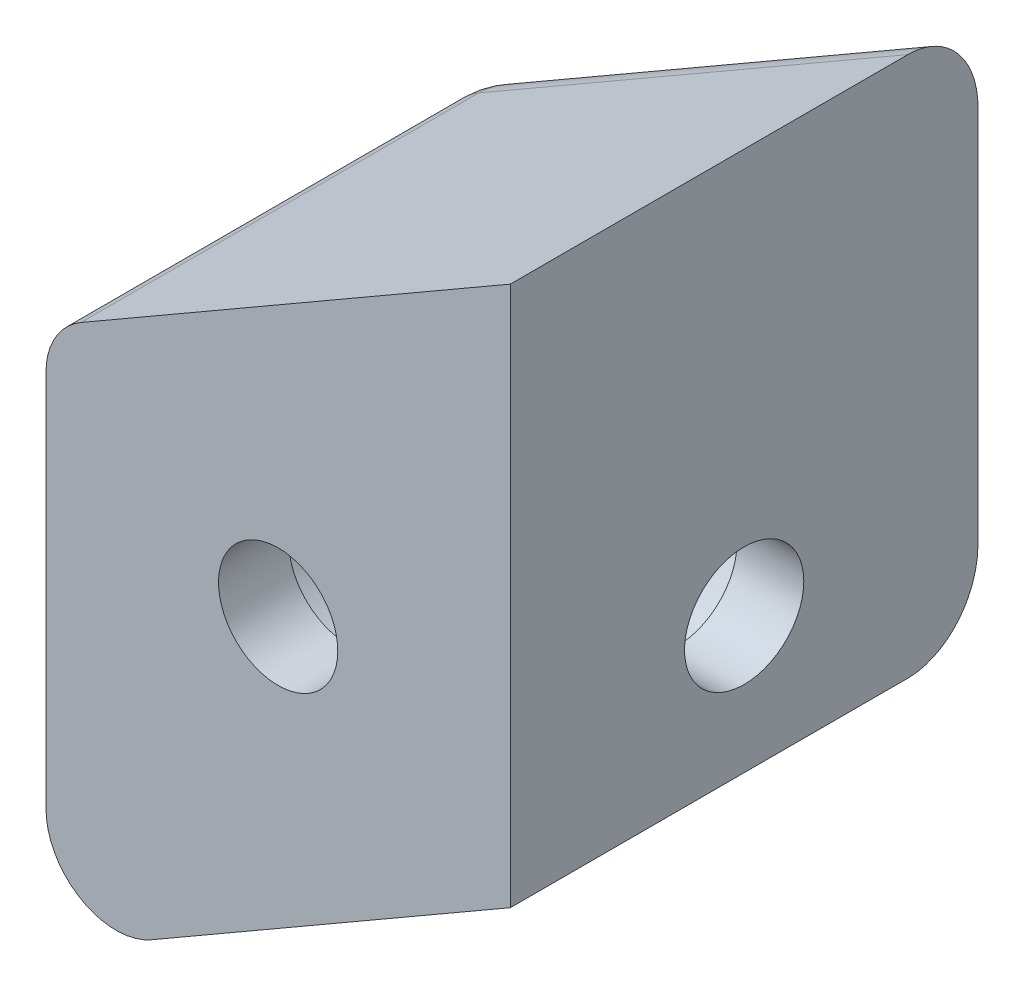
ISO-10303-21;
HEADER;
FILE_DESCRIPTION(('STEP AP214'),'2;1');
FILE_NAME('part.step','',(''),(''),'','','');
FILE_SCHEMA(('AUTOMOTIVE_DESIGN { 1 0 10303 214 1 1 1 1 }'));
ENDSEC;
DATA;
#1=APPLICATION_CONTEXT('core data for automotive mechanical design processes');
#2=APPLICATION_PROTOCOL_DEFINITION('international standard','automotive_design',2000,#1);
#3=PRODUCT_CONTEXT('',#1,'mechanical');
#4=PRODUCT('Part','Part','',(#3));
#5=PRODUCT_RELATED_PRODUCT_CATEGORY('part','',(#4));
#6=PRODUCT_DEFINITION_FORMATION('','',#4);
#7=PRODUCT_DEFINITION_CONTEXT('part definition',#1,'design');
#8=PRODUCT_DEFINITION('design','',#6,#7);
#9=PRODUCT_DEFINITION_SHAPE('','',#8);
#10=(LENGTH_UNIT() NAMED_UNIT(*) SI_UNIT(.MILLI.,.METRE.));
#11=(NAMED_UNIT(*) PLANE_ANGLE_UNIT() SI_UNIT($,.RADIAN.));
#12=(NAMED_UNIT(*) SI_UNIT($,.STERADIAN.) SOLID_ANGLE_UNIT());
#13=UNCERTAINTY_MEASURE_WITH_UNIT(LENGTH_MEASURE(1.E-05),#10,'distance_accuracy_value','');
#14=(GEOMETRIC_REPRESENTATION_CONTEXT(3) GLOBAL_UNCERTAINTY_ASSIGNED_CONTEXT((#13)) GLOBAL_UNIT_ASSIGNED_CONTEXT((#10,
#11,#12)) REPRESENTATION_CONTEXT('',''));
#15=CARTESIAN_POINT('',(0.,0.,0.));
#16=DIRECTION('',(0.,0.,1.));
#17=DIRECTION('',(1.,0.,0.));
#18=AXIS2_PLACEMENT_3D('',#15,#16,#17);
#19=CARTESIAN_POINT('',(-0.0727880054088277,7.27847851737973,17.));
#20=DIRECTION('',(0.,0.,-1.));
#21=DIRECTION('',(-1.,0.,0.));
#22=AXIS2_PLACEMENT_3D('',#19,#20,#21);
#23=CYLINDRICAL_SURFACE('',#22,5.3);
#24=CARTESIAN_POINT('',(-0.0727880054088277,7.27847851737973,0.));
#25=DIRECTION('',(0.,0.,1.));
#26=DIRECTION('',(1.,0.,0.));
#27=AXIS2_PLACEMENT_3D('',#24,#25,#26);
#28=CIRCLE('',#27,5.3);
#29=CARTESIAN_POINT('',(5.22721199459117,7.27847851737973,0.));
#30=VERTEX_POINT('',#29);
#31=EDGE_CURVE('E132',#30,#30,#28,.T.);
#32=ORIENTED_EDGE('',*,*,#31,.F.);
#33=EDGE_LOOP('',(#32));
#34=FACE_BOUND('',#33,.T.);
#35=CARTESIAN_POINT('',(-0.0727880054088277,7.27847851737973,10.));
#36=DIRECTION('',(0.707106781186547,0.,-0.707106781186547));
#37=DIRECTION('',(-0.707106781186547,0.,-0.707106781186547));
#38=AXIS2_PLACEMENT_3D('',#35,#36,#37);
#39=ELLIPSE('',#38,7.4953318805774,5.3);
#40=CARTESIAN_POINT('',(-0.0727880054088277,12.5784785173797,10.));
#41=VERTEX_POINT('',#40);
#42=CARTESIAN_POINT('',(-0.0727880054088277,1.97847851737973,10.));
#43=VERTEX_POINT('',#42);
#44=EDGE_CURVE('E116',#41,#43,#39,.F.);
#45=ORIENTED_EDGE('',*,*,#44,.T.);
#46=CARTESIAN_POINT('',(-0.0727880054088277,7.27847851737973,10.));
#47=DIRECTION('',(-0.707106781186547,0.,-0.707106781186547));
#48=DIRECTION('',(0.707106781186547,0.,-0.707106781186547));
#49=AXIS2_PLACEMENT_3D('',#46,#47,#48);
#50=ELLIPSE('',#49,7.4953318805774,5.3);
#51=EDGE_CURVE('E112',#43,#41,#50,.F.);
#52=ORIENTED_EDGE('',*,*,#51,.T.);
#53=EDGE_LOOP('',(#45,#52));
#54=FACE_BOUND('',#53,.T.);
#55=ADVANCED_FACE('F32',(#34,#54),#23,.F.);
#56=CARTESIAN_POINT('',(-0.0727880054088277,7.27847851737973,16.3));
#57=DIRECTION('',(0.,0.,1.));
#58=DIRECTION('',(1.,0.,0.));
#59=AXIS2_PLACEMENT_3D('',#56,#57,#58);
#60=CIRCLE('',#59,5.3);
#61=CARTESIAN_POINT('',(5.22721199459117,7.27847851737973,16.3));
#62=VERTEX_POINT('',#61);
#63=EDGE_CURVE('E139',#62,#62,#60,.T.);
#64=ORIENTED_EDGE('',*,*,#63,.T.);
#65=EDGE_LOOP('',(#64));
#66=FACE_BOUND('',#65,.T.);
#67=CARTESIAN_POINT('',(-0.0727880054088277,7.27847851737973,10.));
#68=DIRECTION('',(0.707106781186547,0.,-0.707106781186547));
#69=DIRECTION('',(-0.707106781186547,0.,-0.707106781186547));
#70=AXIS2_PLACEMENT_3D('',#67,#68,#69);
#71=ELLIPSE('',#70,7.4953318805774,5.3);
#72=EDGE_CURVE('E108',#41,#43,#71,.T.);
#73=ORIENTED_EDGE('',*,*,#72,.T.);
#74=CARTESIAN_POINT('',(-0.0727880054088277,7.27847851737973,10.));
#75=DIRECTION('',(-0.707106781186547,0.,-0.707106781186547));
#76=DIRECTION('',(0.707106781186547,0.,-0.707106781186547));
#77=AXIS2_PLACEMENT_3D('',#74,#75,#76);
#78=ELLIPSE('',#77,7.4953318805774,5.3);
#79=EDGE_CURVE('E115',#43,#41,#78,.T.);
#80=ORIENTED_EDGE('',*,*,#79,.T.);
#81=EDGE_LOOP('',(#73,#80));
#82=FACE_BOUND('',#81,.T.);
#83=ADVANCED_FACE('F126',(#66,#82),#23,.F.);
#84=CARTESIAN_POINT('',(-10.,7.27847851737973,10.));
#85=DIRECTION('',(1.,0.,0.));
#86=DIRECTION('',(0.,0.,-1.));
#87=AXIS2_PLACEMENT_3D('',#84,#85,#86);
#88=CYLINDRICAL_SURFACE('',#87,2.55);
#89=CARTESIAN_POINT('',(7.,7.27847851737973,10.));
#90=DIRECTION('',(1.,0.,0.));
#91=DIRECTION('',(0.,0.,-1.));
#92=AXIS2_PLACEMENT_3D('',#89,#90,#91);
#93=CIRCLE('',#92,2.55);
#94=CARTESIAN_POINT('',(7.,7.27847851737973,7.45));
#95=VERTEX_POINT('',#94);
#96=EDGE_CURVE('E129',#95,#95,#93,.F.);
#97=ORIENTED_EDGE('',*,*,#96,.T.);
#98=EDGE_LOOP('',(#97));
#99=FACE_BOUND('',#98,.T.);
#100=CARTESIAN_POINT('',(9.8544239891824,7.27847851737973,10.));
#101=DIRECTION('',(1.,0.,0.));
#102=DIRECTION('',(0.,0.,-1.));
#103=AXIS2_PLACEMENT_3D('',#100,#101,#102);
#104=CIRCLE('',#103,2.55);
#105=CARTESIAN_POINT('',(9.8544239891824,7.27847851737973,7.45));
#106=VERTEX_POINT('',#105);
#107=EDGE_CURVE('E261',#106,#106,#104,.T.);
#108=ORIENTED_EDGE('',*,*,#107,.T.);
#109=EDGE_LOOP('',(#108));
#110=FACE_BOUND('',#109,.T.);
#111=ADVANCED_FACE('F242',(#99,#110),#88,.F.);
#112=CARTESIAN_POINT('',(-0.0727880054088277,7.27847851737973,20.));
#113=DIRECTION('',(0.,0.,-1.));
#114=DIRECTION('',(-1.,0.,0.));
#115=AXIS2_PLACEMENT_3D('',#112,#113,#114);
#116=CYLINDRICAL_SURFACE('',#115,2.55);
#117=CARTESIAN_POINT('',(-0.0727880054088277,7.27847851737973,17.));
#118=DIRECTION('',(0.,0.,1.));
#119=DIRECTION('',(1.,0.,0.));
#120=AXIS2_PLACEMENT_3D('',#117,#118,#119);
#121=CIRCLE('',#120,2.55);
#122=CARTESIAN_POINT('',(2.47721199459117,7.27847851737973,17.));
#123=VERTEX_POINT('',#122);
#124=EDGE_CURVE('E260',#123,#123,#121,.T.);
#125=ORIENTED_EDGE('',*,*,#124,.F.);
#126=EDGE_LOOP('',(#125));
#127=FACE_BOUND('',#126,.T.);
#128=CARTESIAN_POINT('',(-0.0727880054088277,7.27847851737973,20.));
#129=DIRECTION('',(0.,0.,1.));
#130=DIRECTION('',(1.,0.,0.));
#131=AXIS2_PLACEMENT_3D('',#128,#129,#130);
#132=CIRCLE('',#131,2.55);
#133=CARTESIAN_POINT('',(2.47721199459117,7.27847851737973,20.));
#134=VERTEX_POINT('',#133);
#135=EDGE_CURVE('E264',#134,#134,#132,.T.);
#136=ORIENTED_EDGE('',*,*,#135,.T.);
#137=EDGE_LOOP('',(#136));
#138=FACE_BOUND('',#137,.T.);
#139=ADVANCED_FACE('F219',(#127,#138),#116,.F.);
#140=CARTESIAN_POINT('',(-10.,-10.,20.));
#141=DIRECTION('',(-0.500000000000001,0.866025403784438,0.));
#142=DIRECTION('',(-0.866025403784438,-0.500000000000001,0.));
#143=AXIS2_PLACEMENT_3D('',#140,#141,#142);
#144=PLANE('',#143);
#145=DIRECTION('',(0.,0.,-1.));
#146=VECTOR('',#145,1.);
#147=CARTESIAN_POINT('',(-5.5,-7.40192378864668,20.));
#148=LINE('',#147,#146);
#149=CARTESIAN_POINT('',(-5.5,-7.40192378864668,20.));
#150=VERTEX_POINT('',#149);
#151=CARTESIAN_POINT('',(-5.5,-7.40192378864668,3.));
#152=VERTEX_POINT('',#151);
#153=EDGE_CURVE('E145',#150,#152,#148,.T.);
#154=ORIENTED_EDGE('',*,*,#153,.T.);
#155=DIRECTION('',(0.866025403784438,0.500000000000001,0.));
#156=VECTOR('',#155,1.);
#157=CARTESIAN_POINT('',(-10.,-10.,3.));
#158=LINE('',#157,#156);
#159=CARTESIAN_POINT('',(9.8544239891824,1.46295703475946,3.));
#160=VERTEX_POINT('',#159);
#161=EDGE_CURVE('E147',#152,#160,#158,.T.);
#162=ORIENTED_EDGE('',*,*,#161,.T.);
#163=DIRECTION('',(0.,0.,-1.));
#164=VECTOR('',#163,1.);
#165=CARTESIAN_POINT('',(9.8544239891824,1.46295703475946,20.));
#166=LINE('',#165,#164);
#167=CARTESIAN_POINT('',(9.8544239891824,1.46295703475946,20.));
#168=VERTEX_POINT('',#167);
#169=EDGE_CURVE('E122',#168,#160,#166,.T.);
#170=ORIENTED_EDGE('',*,*,#169,.F.);
#171=DIRECTION('',(0.866025403784438,0.500000000000001,0.));
#172=VECTOR('',#171,1.);
#173=CARTESIAN_POINT('',(-10.,-10.,20.));
#174=LINE('',#173,#172);
#175=EDGE_CURVE('E277',#150,#168,#174,.T.);
#176=ORIENTED_EDGE('',*,*,#175,.F.);
#177=EDGE_LOOP('',(#154,#162,#170,#176));
#178=FACE_BOUND('',#177,.T.);
#179=ADVANCED_FACE('F215',(#178),#144,.F.);
#180=CARTESIAN_POINT('',(9.8544239891824,1.46295703475946,20.));
#181=DIRECTION('',(-1.,0.,0.));
#182=DIRECTION('',(0.,-1.,0.));
#183=AXIS2_PLACEMENT_3D('',#180,#181,#182);
#184=PLANE('',#183);
#185=ORIENTED_EDGE('',*,*,#107,.F.);
#186=EDGE_LOOP('',(#185));
#187=FACE_BOUND('',#186,.T.);
#188=ORIENTED_EDGE('',*,*,#169,.T.);
#189=CARTESIAN_POINT('',(9.85442398918238,4.9270586498972,3.));
#190=DIRECTION('',(-1.,0.,0.));
#191=DIRECTION('',(0.,1.,0.));
#192=AXIS2_PLACEMENT_3D('',#189,#190,#191);
#193=ELLIPSE('',#192,3.46410161513775,3.);
#194=CARTESIAN_POINT('',(9.85442398918238,4.92705864989721,0.));
#195=VERTEX_POINT('',#194);
#196=EDGE_CURVE('E152',#160,#195,#193,.F.);
#197=ORIENTED_EDGE('',*,*,#196,.T.);
#198=DIRECTION('',(0.,1.,0.));
#199=VECTOR('',#198,1.);
#200=CARTESIAN_POINT('',(9.8544239891824,1.46295703475946,0.));
#201=LINE('',#200,#199);
#202=CARTESIAN_POINT('',(9.85442398918232,21.0928554196217,0.));
#203=VERTEX_POINT('',#202);
#204=EDGE_CURVE('E274',#195,#203,#201,.T.);
#205=ORIENTED_EDGE('',*,*,#204,.T.);
#206=CARTESIAN_POINT('',(9.85442398918232,21.0928554196217,3.));
#207=DIRECTION('',(-1.,0.,0.));
#208=DIRECTION('',(0.,-1.,0.));
#209=AXIS2_PLACEMENT_3D('',#206,#207,#208);
#210=ELLIPSE('',#209,3.46410161513775,3.);
#211=CARTESIAN_POINT('',(9.85442398918231,24.5569570347595,3.));
#212=VERTEX_POINT('',#211);
#213=EDGE_CURVE('E150',#203,#212,#210,.F.);
#214=ORIENTED_EDGE('',*,*,#213,.T.);
#215=DIRECTION('',(0.,0.,-1.));
#216=VECTOR('',#215,1.);
#217=CARTESIAN_POINT('',(9.85442398918231,24.5569570347595,20.));
#218=LINE('',#217,#216);
#219=CARTESIAN_POINT('',(9.85442398918231,24.5569570347595,20.));
#220=VERTEX_POINT('',#219);
#221=EDGE_CURVE('E271',#220,#212,#218,.T.);
#222=ORIENTED_EDGE('',*,*,#221,.F.);
#223=DIRECTION('',(0.,1.,0.));
#224=VECTOR('',#223,1.);
#225=CARTESIAN_POINT('',(9.8544239891824,1.46295703475946,20.));
#226=LINE('',#225,#224);
#227=EDGE_CURVE('E282',#168,#220,#226,.T.);
#228=ORIENTED_EDGE('',*,*,#227,.F.);
#229=EDGE_LOOP('',(#188,#197,#205,#214,#222,#228));
#230=FACE_BOUND('',#229,.T.);
#231=ADVANCED_FACE('F218',(#187,#230),#184,.F.);
#232=CARTESIAN_POINT('',(-10.,13.094,20.));
#233=DIRECTION('',(0.500000000000002,-0.866025403784438,0.));
#234=DIRECTION('',(0.866025403784438,0.500000000000002,0.));
#235=AXIS2_PLACEMENT_3D('',#232,#233,#234);
#236=PLANE('',#235);
#237=DIRECTION('',(-0.866025403784438,-0.500000000000002,0.));
#238=VECTOR('',#237,1.);
#239=CARTESIAN_POINT('',(-10.,13.094,3.));
#240=LINE('',#239,#238);
#241=CARTESIAN_POINT('',(-8.50000000000002,13.9600254037845,3.));
#242=VERTEX_POINT('',#241);
#243=EDGE_CURVE('E41',#212,#242,#240,.T.);
#244=ORIENTED_EDGE('',*,*,#243,.T.);
#245=DIRECTION('',(0.,0.,-1.));
#246=VECTOR('',#245,1.);
#247=CARTESIAN_POINT('',(-8.50000000000002,13.9600254037845,20.));
#248=LINE('',#247,#246);
#249=CARTESIAN_POINT('',(-8.50000000000002,13.9600254037845,20.));
#250=VERTEX_POINT('',#249);
#251=EDGE_CURVE('E11',#242,#250,#248,.F.);
#252=ORIENTED_EDGE('',*,*,#251,.T.);
#253=DIRECTION('',(-0.866025403784438,-0.500000000000002,0.));
#254=VECTOR('',#253,1.);
#255=CARTESIAN_POINT('',(-10.,13.094,20.));
#256=LINE('',#255,#254);
#257=EDGE_CURVE('E280',#220,#250,#256,.T.);
#258=ORIENTED_EDGE('',*,*,#257,.F.);
#259=ORIENTED_EDGE('',*,*,#221,.T.);
#260=EDGE_LOOP('',(#244,#252,#258,#259));
#261=FACE_BOUND('',#260,.T.);
#262=ADVANCED_FACE('F223',(#261),#236,.F.);
#263=CARTESIAN_POINT('',(-10.,-10.,20.));
#264=DIRECTION('',(1.,0.,0.));
#265=DIRECTION('',(0.,1.,0.));
#266=AXIS2_PLACEMENT_3D('',#263,#264,#265);
#267=PLANE('',#266);
#268=DIRECTION('',(0.,-1.,0.));
#269=VECTOR('',#268,1.);
#270=CARTESIAN_POINT('',(-10.,-10.,20.));
#271=LINE('',#270,#269);
#272=CARTESIAN_POINT('',(-10.,11.3619491924312,20.));
#273=VERTEX_POINT('',#272);
#274=CARTESIAN_POINT('',(-10.,-4.80384757729337,20.));
#275=VERTEX_POINT('',#274);
#276=EDGE_CURVE('E273',#273,#275,#271,.T.);
#277=ORIENTED_EDGE('',*,*,#276,.F.);
#278=DIRECTION('',(0.,0.,-1.));
#279=VECTOR('',#278,1.);
#280=CARTESIAN_POINT('',(-10.,11.3619491924312,20.));
#281=LINE('',#280,#279);
#282=CARTESIAN_POINT('',(-10.,11.3619491924312,13.3786487307791));
#283=VERTEX_POINT('',#282);
#284=EDGE_CURVE('E166',#273,#283,#281,.T.);
#285=ORIENTED_EDGE('',*,*,#284,.T.);
#286=CARTESIAN_POINT('',(-10.,7.27847851737973,10.));
#287=DIRECTION('',(1.,0.,0.));
#288=DIRECTION('',(0.,0.,-1.));
#289=AXIS2_PLACEMENT_3D('',#286,#287,#288);
#290=CIRCLE('',#289,5.3);
#291=CARTESIAN_POINT('',(-10.,11.3619491924312,6.62135126922092));
#292=VERTEX_POINT('',#291);
#293=EDGE_CURVE('E133',#283,#292,#290,.T.);
#294=ORIENTED_EDGE('',*,*,#293,.T.);
#295=DIRECTION('',(0.,0.,-1.));
#296=VECTOR('',#295,1.);
#297=CARTESIAN_POINT('',(-10.,11.3619491924312,20.));
#298=LINE('',#297,#296);
#299=CARTESIAN_POINT('',(-10.,11.3619491924312,3.));
#300=VERTEX_POINT('',#299);
#301=EDGE_CURVE('E162',#292,#300,#298,.T.);
#302=ORIENTED_EDGE('',*,*,#301,.T.);
#303=DIRECTION('',(0.,-1.,0.));
#304=VECTOR('',#303,1.);
#305=CARTESIAN_POINT('',(-10.,-10.,3.));
#306=LINE('',#305,#304);
#307=CARTESIAN_POINT('',(-10.,-4.80384757729337,3.));
#308=VERTEX_POINT('',#307);
#309=EDGE_CURVE('E160',#300,#308,#306,.T.);
#310=ORIENTED_EDGE('',*,*,#309,.T.);
#311=DIRECTION('',(0.,0.,-1.));
#312=VECTOR('',#311,1.);
#313=CARTESIAN_POINT('',(-10.,-4.80384757729337,20.));
#314=LINE('',#313,#312);
#315=EDGE_CURVE('E164',#308,#275,#314,.F.);
#316=ORIENTED_EDGE('',*,*,#315,.T.);
#317=EDGE_LOOP('',(#277,#285,#294,#302,#310,#316));
#318=FACE_BOUND('',#317,.T.);
#319=ADVANCED_FACE('F227',(#318),#267,.F.);
#320=CARTESIAN_POINT('',(0.,0.,20.));
#321=DIRECTION('',(0.,0.,1.));
#322=DIRECTION('',(1.,0.,0.));
#323=AXIS2_PLACEMENT_3D('',#320,#321,#322);
#324=PLANE('',#323);
#325=ORIENTED_EDGE('',*,*,#135,.F.);
#326=EDGE_LOOP('',(#325));
#327=FACE_BOUND('',#326,.T.);
#328=ORIENTED_EDGE('',*,*,#276,.T.);
#329=CARTESIAN_POINT('',(-7.00000000000001,-4.80384757729336,20.));
#330=DIRECTION('',(0.,0.,1.));
#331=DIRECTION('',(1.,0.,0.));
#332=AXIS2_PLACEMENT_3D('',#329,#330,#331);
#333=CIRCLE('',#332,3.);
#334=EDGE_CURVE('E170',#275,#150,#333,.T.);
#335=ORIENTED_EDGE('',*,*,#334,.T.);
#336=ORIENTED_EDGE('',*,*,#175,.T.);
#337=ORIENTED_EDGE('',*,*,#227,.T.);
#338=ORIENTED_EDGE('',*,*,#257,.T.);
#339=CARTESIAN_POINT('',(-7.00000000000002,11.3619491924312,20.));
#340=DIRECTION('',(0.,0.,1.));
#341=DIRECTION('',(1.,0.,0.));
#342=AXIS2_PLACEMENT_3D('',#339,#340,#341);
#343=CIRCLE('',#342,3.);
#344=EDGE_CURVE('E168',#250,#273,#343,.T.);
#345=ORIENTED_EDGE('',*,*,#344,.T.);
#346=EDGE_LOOP('',(#328,#335,#336,#337,#338,#345));
#347=FACE_BOUND('',#346,.T.);
#348=ADVANCED_FACE('F230',(#327,#347),#324,.T.);
#349=CARTESIAN_POINT('',(0.,0.,0.));
#350=DIRECTION('',(0.,0.,1.));
#351=DIRECTION('',(1.,0.,0.));
#352=AXIS2_PLACEMENT_3D('',#349,#350,#351);
#353=PLANE('',#352);
#354=ORIENTED_EDGE('',*,*,#204,.F.);
#355=DIRECTION('',(0.866025403784438,0.500000000000001,0.));
#356=VECTOR('',#355,1.);
#357=CARTESIAN_POINT('',(0.330127018922185,-0.571796769724474,0.));
#358=LINE('',#357,#356);
#359=CARTESIAN_POINT('',(-7.00000000000001,-4.80384757729336,0.));
#360=VERTEX_POINT('',#359);
#361=EDGE_CURVE('E158',#195,#360,#358,.F.);
#362=ORIENTED_EDGE('',*,*,#361,.T.);
#363=DIRECTION('',(0.,-1.,0.));
#364=VECTOR('',#363,1.);
#365=CARTESIAN_POINT('',(-7.00000000000001,0.,0.));
#366=LINE('',#365,#364);
#367=CARTESIAN_POINT('',(-7.00000000000002,11.3619491924312,0.));
#368=VERTEX_POINT('',#367);
#369=EDGE_CURVE('E154',#360,#368,#366,.F.);
#370=ORIENTED_EDGE('',*,*,#369,.T.);
#371=DIRECTION('',(-0.866025403784438,-0.500000000000002,0.));
#372=VECTOR('',#371,1.);
#373=CARTESIAN_POINT('',(-6.66986831857676,11.5525508075689,0.));
#374=LINE('',#373,#372);
#375=EDGE_CURVE('E156',#368,#203,#374,.F.);
#376=ORIENTED_EDGE('',*,*,#375,.T.);
#377=EDGE_LOOP('',(#354,#362,#370,#376));
#378=FACE_BOUND('',#377,.T.);
#379=ORIENTED_EDGE('',*,*,#31,.T.);
#380=EDGE_LOOP('',(#379));
#381=FACE_BOUND('',#380,.T.);
#382=ADVANCED_FACE('F232',(#378,#381),#353,.F.);
#383=CARTESIAN_POINT('',(-0.0727880054088277,7.27847851737973,17.));
#384=DIRECTION('',(0.,0.,1.));
#385=DIRECTION('',(1.,0.,0.));
#386=AXIS2_PLACEMENT_3D('',#383,#384,#385);
#387=PLANE('',#386);
#388=CARTESIAN_POINT('',(-0.0727880054088277,7.27847851737973,17.));
#389=DIRECTION('',(0.,0.,1.));
#390=DIRECTION('',(1.,0.,0.));
#391=AXIS2_PLACEMENT_3D('',#388,#389,#390);
#392=CIRCLE('',#391,4.6);
#393=CARTESIAN_POINT('',(4.52721199459117,7.27847851737973,17.));
#394=VERTEX_POINT('',#393);
#395=EDGE_CURVE('E142',#394,#394,#392,.F.);
#396=ORIENTED_EDGE('',*,*,#395,.T.);
#397=EDGE_LOOP('',(#396));
#398=FACE_BOUND('',#397,.T.);
#399=ORIENTED_EDGE('',*,*,#124,.T.);
#400=EDGE_LOOP('',(#399));
#401=FACE_BOUND('',#400,.T.);
#402=ADVANCED_FACE('F235',(#398,#401),#387,.F.);
#403=CARTESIAN_POINT('',(7.,7.27847851737973,10.));
#404=DIRECTION('',(-1.,0.,0.));
#405=DIRECTION('',(0.,0.,1.));
#406=AXIS2_PLACEMENT_3D('',#403,#404,#405);
#407=CYLINDRICAL_SURFACE('',#406,5.3);
#408=ORIENTED_EDGE('',*,*,#293,.F.);
#409=CARTESIAN_POINT('',(-10.,11.3619491924312,13.3786487307791));
#410=CARTESIAN_POINT('',(-9.99998227641646,11.4430226051257,13.2806818391411));
#411=CARTESIAN_POINT('',(-9.99671494608834,11.5205033017067,13.179840702592));
#412=CARTESIAN_POINT('',(-9.98528205328744,11.6678429901761,12.9731357786423));
#413=CARTESIAN_POINT('',(-9.97712127300982,11.7377093446175,12.8672769877138));
#414=CARTESIAN_POINT('',(-9.95748603316138,11.8696119939335,12.6509569703778));
#415=CARTESIAN_POINT('',(-9.94600814882947,11.9316401005528,12.540491088736));
#416=CARTESIAN_POINT('',(-9.92120410189052,12.0475751396846,12.3155412741885));
#417=CARTESIAN_POINT('',(-9.90787736111092,12.1014795207093,12.2010560927692));
#418=CARTESIAN_POINT('',(-9.87945941772156,12.2056931607828,11.9574821327905));
#419=CARTESIAN_POINT('',(-9.8643211369463,12.2551695185656,11.8280417719367));
#420=CARTESIAN_POINT('',(-9.8351397491628,12.3438676907592,11.565573669992));
#421=CARTESIAN_POINT('',(-9.82109662928132,12.3830896257197,11.4325459710938));
#422=CARTESIAN_POINT('',(-9.79558550512172,12.4509940107591,11.1637338373244));
#423=CARTESIAN_POINT('',(-9.78411464591157,12.4796881682731,11.0279526429619));
#424=CARTESIAN_POINT('',(-9.76491874937976,12.5263645453714,10.7542929892554));
#425=CARTESIAN_POINT('',(-9.75719369252534,12.5443468208136,10.6164145408516));
#426=CARTESIAN_POINT('',(-9.7460159074505,12.5700923465991,10.3320714979365));
#427=CARTESIAN_POINT('',(-9.74281375763576,12.5772576527707,10.1855420636194));
#428=CARTESIAN_POINT('',(-9.74185751059055,12.5794130388503,9.89237066135677));
#429=CARTESIAN_POINT('',(-9.74410366390626,12.5744025588414,9.74572868854601));
#430=CARTESIAN_POINT('',(-9.75378346328418,12.5522519790349,9.45333764645798));
#431=CARTESIAN_POINT('',(-9.76122430758256,12.5350950475446,9.30759009962603));
#432=CARTESIAN_POINT('',(-9.78042555745168,12.4888287241983,9.01831094072579));
#433=CARTESIAN_POINT('',(-9.79218588399413,12.4597195510166,8.87477928816604));
#434=CARTESIAN_POINT('',(-9.8179418548677,12.3917294139023,8.59866156984875));
#435=CARTESIAN_POINT('',(-9.83177950904417,12.353472014793,8.46590695926698));
#436=CARTESIAN_POINT('',(-9.86066048239053,12.2667720505166,8.2038897171875));
#437=CARTESIAN_POINT('',(-9.87570436567679,12.2183247024278,8.07462875779377));
#438=CARTESIAN_POINT('',(-9.92018323919742,12.0582420362981,7.69360392400582));
#439=CARTESIAN_POINT('',(-9.94906474177469,11.9316535394885,7.44773766585804));
#440=CARTESIAN_POINT('',(-9.97892003650794,11.7227323857534,7.10978065418797));
#441=CARTESIAN_POINT('',(-9.98646239879932,11.6553695537302,7.00874780852358));
#442=CARTESIAN_POINT('',(-9.99699579794546,11.5137568778763,6.81140281771894));
#443=CARTESIAN_POINT('',(-9.99998715368307,11.4395075169621,6.71509034228647));
#444=CARTESIAN_POINT('',(-10.,11.3619491924312,6.62135126922092));
#445=B_SPLINE_CURVE_WITH_KNOTS('',3,(#409,#410,#411,#412,#413,#414,#415,#416,#417,#418,#419,
#420,#421,#422,#423,#424,#425,#426,#427,#428,#429,#430,#431,#432,#433,#434,#435,#436,#437,#438,
#439,#440,#441,#442,#443,#444),.UNSPECIFIED.,.F.,.F.,(4,2,2,2,2,2,2,2,2,2,2,2,2,2,2,2,2,4),(0.,
0.381257382431612,0.762142781394369,1.143422840974,1.52482240397486,1.94258918779887,
2.36035106018713,2.77764694138055,3.19494064653225,3.63455119897558,4.07418196777436,
4.51442314123318,4.95465626053797,5.37074237260648,5.78702422326858,6.61693858812111,
6.981633693138,7.34630324328738),.UNSPECIFIED.);
#446=EDGE_CURVE('E172',#283,#292,#445,.T.);
#447=ORIENTED_EDGE('',*,*,#446,.T.);
#448=EDGE_LOOP('',(#408,#447));
#449=FACE_BOUND('',#448,.T.);
#450=ORIENTED_EDGE('',*,*,#44,.F.);
#451=ORIENTED_EDGE('',*,*,#79,.F.);
#452=EDGE_LOOP('',(#450,#451));
#453=FACE_BOUND('',#452,.T.);
#454=ADVANCED_FACE('F120',(#449,#453),#407,.F.);
#455=CARTESIAN_POINT('',(7.,7.27847851737973,10.));
#456=DIRECTION('',(1.,0.,0.));
#457=DIRECTION('',(0.,0.,-1.));
#458=AXIS2_PLACEMENT_3D('',#455,#456,#457);
#459=PLANE('',#458);
#460=CARTESIAN_POINT('',(7.,7.27847851737973,10.));
#461=DIRECTION('',(1.,0.,0.));
#462=DIRECTION('',(0.,0.,-1.));
#463=AXIS2_PLACEMENT_3D('',#460,#461,#462);
#464=CIRCLE('',#463,4.6);
#465=CARTESIAN_POINT('',(7.,7.27847851737973,5.4));
#466=VERTEX_POINT('',#465);
#467=EDGE_CURVE('E136',#466,#466,#464,.F.);
#468=ORIENTED_EDGE('',*,*,#467,.T.);
#469=EDGE_LOOP('',(#468));
#470=FACE_BOUND('',#469,.T.);
#471=ORIENTED_EDGE('',*,*,#96,.F.);
#472=EDGE_LOOP('',(#471));
#473=FACE_BOUND('',#472,.T.);
#474=ADVANCED_FACE('F254',(#470,#473),#459,.F.);
#475=CARTESIAN_POINT('',(6.3,7.27847851737973,10.));
#476=DIRECTION('',(1.,0.,0.));
#477=DIRECTION('',(0.,0.,-1.));
#478=AXIS2_PLACEMENT_3D('',#475,#476,#477);
#479=CIRCLE('',#478,5.3);
#480=CARTESIAN_POINT('',(6.3,7.27847851737973,4.7));
#481=VERTEX_POINT('',#480);
#482=EDGE_CURVE('E124',#481,#481,#479,.T.);
#483=ORIENTED_EDGE('',*,*,#482,.T.);
#484=EDGE_LOOP('',(#483));
#485=FACE_BOUND('',#484,.T.);
#486=ORIENTED_EDGE('',*,*,#72,.F.);
#487=ORIENTED_EDGE('',*,*,#51,.F.);
#488=EDGE_LOOP('',(#486,#487));
#489=FACE_BOUND('',#488,.T.);
#490=ADVANCED_FACE('F110',(#485,#489),#407,.F.);
#491=CARTESIAN_POINT('',(6.3,7.27847851737973,10.));
#492=DIRECTION('',(1.,0.,0.));
#493=DIRECTION('',(0.,0.,-1.));
#494=AXIS2_PLACEMENT_3D('',#491,#492,#493);
#495=TOROIDAL_SURFACE('',#494,4.6,0.7);
#496=ORIENTED_EDGE('',*,*,#467,.F.);
#497=EDGE_LOOP('',(#496));
#498=FACE_BOUND('',#497,.T.);
#499=ORIENTED_EDGE('',*,*,#482,.F.);
#500=EDGE_LOOP('',(#499));
#501=FACE_BOUND('',#500,.T.);
#502=ADVANCED_FACE('F210',(#498,#501),#495,.F.);
#503=CARTESIAN_POINT('',(-0.0727880054088277,7.27847851737973,16.3));
#504=DIRECTION('',(0.,0.,1.));
#505=DIRECTION('',(1.,0.,0.));
#506=AXIS2_PLACEMENT_3D('',#503,#504,#505);
#507=TOROIDAL_SURFACE('',#506,4.6,0.7);
#508=ORIENTED_EDGE('',*,*,#395,.F.);
#509=EDGE_LOOP('',(#508));
#510=FACE_BOUND('',#509,.T.);
#511=ORIENTED_EDGE('',*,*,#63,.F.);
#512=EDGE_LOOP('',(#511));
#513=FACE_BOUND('',#512,.T.);
#514=ADVANCED_FACE('F207',(#510,#513),#507,.F.);
#515=CARTESIAN_POINT('',(-8.50000000000001,10.4959237886467,3.));
#516=DIRECTION('',(-0.866025403784438,-0.500000000000002,0.));
#517=DIRECTION('',(0.500000000000002,-0.866025403784438,0.));
#518=AXIS2_PLACEMENT_3D('',#515,#516,#517);
#519=CYLINDRICAL_SURFACE('',#518,3.);
#520=ORIENTED_EDGE('',*,*,#213,.F.);
#521=ORIENTED_EDGE('',*,*,#375,.F.);
#522=CARTESIAN_POINT('',(-7.00000000000001,11.3619491924312,3.));
#523=DIRECTION('',(-0.866025403784438,-0.500000000000002,0.));
#524=DIRECTION('',(0.500000000000002,-0.866025403784438,0.));
#525=AXIS2_PLACEMENT_3D('',#522,#523,#524);
#526=CIRCLE('',#525,3.);
#527=EDGE_CURVE('E36',#242,#368,#526,.T.);
#528=ORIENTED_EDGE('',*,*,#527,.F.);
#529=ORIENTED_EDGE('',*,*,#243,.F.);
#530=EDGE_LOOP('',(#520,#521,#528,#529));
#531=FACE_BOUND('',#530,.T.);
#532=ADVANCED_FACE('F34',(#531),#519,.T.);
#533=CARTESIAN_POINT('',(-7.00000000000002,11.3619491924312,20.));
#534=DIRECTION('',(0.,0.,-1.));
#535=DIRECTION('',(-1.,0.,0.));
#536=AXIS2_PLACEMENT_3D('',#533,#534,#535);
#537=CYLINDRICAL_SURFACE('',#536,3.);
#538=ORIENTED_EDGE('',*,*,#344,.F.);
#539=ORIENTED_EDGE('',*,*,#251,.F.);
#540=CARTESIAN_POINT('',(-7.00000000000001,11.3619491924312,3.));
#541=DIRECTION('',(0.,0.,-1.));
#542=DIRECTION('',(-1.,0.,0.));
#543=AXIS2_PLACEMENT_3D('',#540,#541,#542);
#544=CIRCLE('',#543,3.);
#545=EDGE_CURVE('E291',#300,#242,#544,.T.);
#546=ORIENTED_EDGE('',*,*,#545,.F.);
#547=ORIENTED_EDGE('',*,*,#301,.F.);
#548=ORIENTED_EDGE('',*,*,#446,.F.);
#549=ORIENTED_EDGE('',*,*,#284,.F.);
#550=EDGE_LOOP('',(#538,#539,#546,#547,#548,#549));
#551=FACE_BOUND('',#550,.T.);
#552=ADVANCED_FACE('F182',(#551),#537,.T.);
#553=CARTESIAN_POINT('',(-7.00000000000002,11.3619491924312,3.));
#554=DIRECTION('',(0.,0.,1.));
#555=DIRECTION('',(1.,0.,0.));
#556=AXIS2_PLACEMENT_3D('',#553,#554,#555);
#557=SPHERICAL_SURFACE('',#556,3.);
#558=ORIENTED_EDGE('',*,*,#545,.T.);
#559=ORIENTED_EDGE('',*,*,#527,.T.);
#560=CARTESIAN_POINT('',(-7.00000000000002,11.3619491924312,3.));
#561=DIRECTION('',(0.,1.,0.));
#562=DIRECTION('',(0.,0.,1.));
#563=AXIS2_PLACEMENT_3D('',#560,#561,#562);
#564=CIRCLE('',#563,3.);
#565=EDGE_CURVE('E296',#300,#368,#564,.F.);
#566=ORIENTED_EDGE('',*,*,#565,.F.);
#567=EDGE_LOOP('',(#558,#559,#566));
#568=FACE_BOUND('',#567,.T.);
#569=ADVANCED_FACE('F186',(#568),#557,.T.);
#570=CARTESIAN_POINT('',(-7.,-10.,3.));
#571=DIRECTION('',(0.,-1.,0.));
#572=DIRECTION('',(1.,0.,0.));
#573=AXIS2_PLACEMENT_3D('',#570,#571,#572);
#574=CYLINDRICAL_SURFACE('',#573,3.);
#575=ORIENTED_EDGE('',*,*,#565,.T.);
#576=ORIENTED_EDGE('',*,*,#369,.F.);
#577=CARTESIAN_POINT('',(-7.00000000000001,-4.80384757729336,3.));
#578=DIRECTION('',(0.,-1.,0.));
#579=DIRECTION('',(1.,0.,0.));
#580=AXIS2_PLACEMENT_3D('',#577,#578,#579);
#581=CIRCLE('',#580,3.);
#582=EDGE_CURVE('E298',#308,#360,#581,.T.);
#583=ORIENTED_EDGE('',*,*,#582,.F.);
#584=ORIENTED_EDGE('',*,*,#309,.F.);
#585=EDGE_LOOP('',(#575,#576,#583,#584));
#586=FACE_BOUND('',#585,.T.);
#587=ADVANCED_FACE('F190',(#586),#574,.T.);
#588=CARTESIAN_POINT('',(-7.00000000000001,-4.80384757729336,20.));
#589=DIRECTION('',(0.,0.,-1.));
#590=DIRECTION('',(-1.,0.,0.));
#591=AXIS2_PLACEMENT_3D('',#588,#589,#590);
#592=CYLINDRICAL_SURFACE('',#591,3.);
#593=ORIENTED_EDGE('',*,*,#334,.F.);
#594=ORIENTED_EDGE('',*,*,#315,.F.);
#595=CARTESIAN_POINT('',(-7.00000000000001,-4.80384757729336,3.));
#596=DIRECTION('',(0.,0.,-1.));
#597=DIRECTION('',(-1.,0.,0.));
#598=AXIS2_PLACEMENT_3D('',#595,#596,#597);
#599=CIRCLE('',#598,3.);
#600=EDGE_CURVE('E303',#152,#308,#599,.T.);
#601=ORIENTED_EDGE('',*,*,#600,.F.);
#602=ORIENTED_EDGE('',*,*,#153,.F.);
#603=EDGE_LOOP('',(#593,#594,#601,#602));
#604=FACE_BOUND('',#603,.T.);
#605=ADVANCED_FACE('F194',(#604),#592,.T.);
#606=CARTESIAN_POINT('',(-7.00000000000001,-4.80384757729336,3.));
#607=DIRECTION('',(0.,0.,1.));
#608=DIRECTION('',(1.,0.,0.));
#609=AXIS2_PLACEMENT_3D('',#606,#607,#608);
#610=SPHERICAL_SURFACE('',#609,3.);
#611=ORIENTED_EDGE('',*,*,#600,.T.);
#612=ORIENTED_EDGE('',*,*,#582,.T.);
#613=CARTESIAN_POINT('',(-7.00000000000001,-4.80384757729336,3.));
#614=DIRECTION('',(-0.866025403784438,-0.500000000000001,0.));
#615=DIRECTION('',(0.500000000000001,-0.866025403784438,0.));
#616=AXIS2_PLACEMENT_3D('',#613,#614,#615);
#617=CIRCLE('',#616,3.);
#618=EDGE_CURVE('E306',#152,#360,#617,.F.);
#619=ORIENTED_EDGE('',*,*,#618,.F.);
#620=EDGE_LOOP('',(#611,#612,#619));
#621=FACE_BOUND('',#620,.T.);
#622=ADVANCED_FACE('F198',(#621),#610,.T.);
#623=CARTESIAN_POINT('',(-11.5,-7.40192378864669,3.));
#624=DIRECTION('',(0.866025403784438,0.500000000000001,0.));
#625=DIRECTION('',(-0.500000000000001,0.866025403784438,0.));
#626=AXIS2_PLACEMENT_3D('',#623,#624,#625);
#627=CYLINDRICAL_SURFACE('',#626,3.);
#628=ORIENTED_EDGE('',*,*,#618,.T.);
#629=ORIENTED_EDGE('',*,*,#361,.F.);
#630=ORIENTED_EDGE('',*,*,#196,.F.);
#631=ORIENTED_EDGE('',*,*,#161,.F.);
#632=EDGE_LOOP('',(#628,#629,#630,#631));
#633=FACE_BOUND('',#632,.T.);
#634=ADVANCED_FACE('F202',(#633),#627,.T.);
#635=CLOSED_SHELL('',(#55,#83,#111,#139,#179,#231,#262,#319,#348,#382,#402,#454,#474,#490,#502,
#514,#532,#552,#569,#587,#605,#622,#634));
#636=MANIFOLD_SOLID_BREP('B2',#635);
#637=ADVANCED_BREP_SHAPE_REPRESENTATION('',(#18,#636),#14);
#638=SHAPE_DEFINITION_REPRESENTATION(#9,#637);
ENDSEC;
END-ISO-10303-21;
